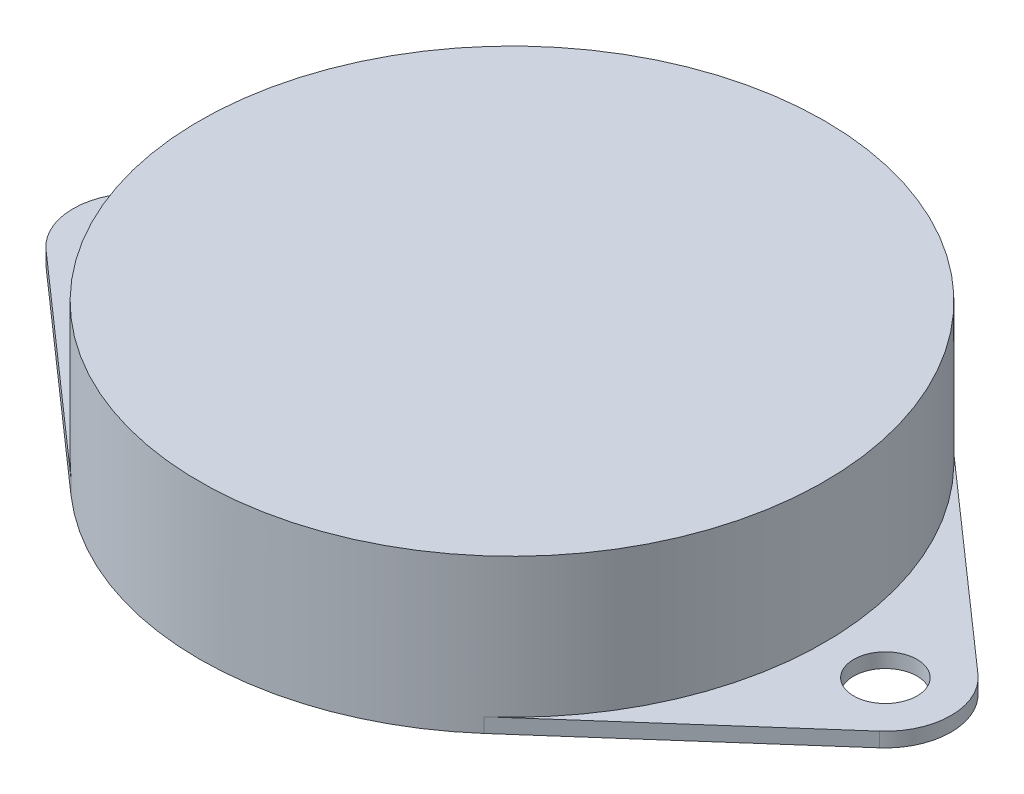
ISO-10303-21;
HEADER;
FILE_DESCRIPTION(('STEP AP214'),'2;1');
FILE_NAME('part.step','',(''),(''),'','','');
FILE_SCHEMA(('AUTOMOTIVE_DESIGN { 1 0 10303 214 1 1 1 1 }'));
ENDSEC;
DATA;
#1=APPLICATION_CONTEXT('core data for automotive mechanical design processes');
#2=APPLICATION_PROTOCOL_DEFINITION('international standard','automotive_design',2000,#1);
#3=PRODUCT_CONTEXT('',#1,'mechanical');
#4=PRODUCT('Part','Part','',(#3));
#5=PRODUCT_RELATED_PRODUCT_CATEGORY('part','',(#4));
#6=PRODUCT_DEFINITION_FORMATION('','',#4);
#7=PRODUCT_DEFINITION_CONTEXT('part definition',#1,'design');
#8=PRODUCT_DEFINITION('design','',#6,#7);
#9=PRODUCT_DEFINITION_SHAPE('','',#8);
#10=(LENGTH_UNIT() NAMED_UNIT(*) SI_UNIT(.MILLI.,.METRE.));
#11=(NAMED_UNIT(*) PLANE_ANGLE_UNIT() SI_UNIT($,.RADIAN.));
#12=(NAMED_UNIT(*) SI_UNIT($,.STERADIAN.) SOLID_ANGLE_UNIT());
#13=UNCERTAINTY_MEASURE_WITH_UNIT(LENGTH_MEASURE(1.E-05),#10,'distance_accuracy_value','');
#14=(GEOMETRIC_REPRESENTATION_CONTEXT(3) GLOBAL_UNCERTAINTY_ASSIGNED_CONTEXT((#13)) GLOBAL_UNIT_ASSIGNED_CONTEXT((#10,
#11,#12)) REPRESENTATION_CONTEXT('',''));
#15=CARTESIAN_POINT('',(0.,0.,0.));
#16=DIRECTION('',(0.,0.,1.));
#17=DIRECTION('',(1.,0.,0.));
#18=AXIS2_PLACEMENT_3D('',#15,#16,#17);
#19=CARTESIAN_POINT('',(20.955,0.8128,0.));
#20=DIRECTION('',(0.,-1.,0.));
#21=DIRECTION('',(0.,0.,-1.));
#22=AXIS2_PLACEMENT_3D('',#19,#20,#21);
#23=PLANE('',#22);
#24=CARTESIAN_POINT('',(20.955,0.8128,0.));
#25=DIRECTION('',(0.,1.,0.));
#26=DIRECTION('',(0.,0.,-1.));
#27=AXIS2_PLACEMENT_3D('',#24,#25,#26);
#28=CIRCLE('',#27,1.778);
#29=CARTESIAN_POINT('',(20.955,0.8128,-1.778));
#30=VERTEX_POINT('',#29);
#31=EDGE_CURVE('E296',#30,#30,#28,.T.);
#32=ORIENTED_EDGE('',*,*,#31,.F.);
#33=EDGE_LOOP('',(#32));
#34=FACE_BOUND('',#33,.T.);
#35=CARTESIAN_POINT('',(0.,0.8128,0.));
#36=DIRECTION('',(0.,1.,0.));
#37=DIRECTION('',(0.,0.,1.));
#38=AXIS2_PLACEMENT_3D('',#35,#36,#37);
#39=CIRCLE('',#38,17.5387);
#40=CARTESIAN_POINT('',(11.596801030303,0.8128,13.1575150979797));
#41=VERTEX_POINT('',#40);
#42=CARTESIAN_POINT('',(11.596801030303,0.8128,-13.1575150979797));
#43=VERTEX_POINT('',#42);
#44=EDGE_CURVE('E197',#41,#43,#39,.T.);
#45=ORIENTED_EDGE('',*,*,#44,.F.);
#46=DIRECTION('',(0.750198994109007,0.,-0.661212121212121));
#47=VECTOR('',#46,1.);
#48=CARTESIAN_POINT('',(23.3902442424242,0.8128,2.76298289530347));
#49=LINE('',#48,#47);
#50=CARTESIAN_POINT('',(23.3902442424242,0.8128,2.76298289530347));
#51=VERTEX_POINT('',#50);
#52=EDGE_CURVE('E60',#41,#51,#49,.T.);
#53=ORIENTED_EDGE('',*,*,#52,.T.);
#54=CARTESIAN_POINT('',(20.955,0.8128,0.));
#55=DIRECTION('',(0.,1.,0.));
#56=DIRECTION('',(0.,0.,-1.));
#57=AXIS2_PLACEMENT_3D('',#54,#55,#56);
#58=CIRCLE('',#57,3.683);
#59=CARTESIAN_POINT('',(23.3902442424242,0.8128,-2.76298289530347));
#60=VERTEX_POINT('',#59);
#61=EDGE_CURVE('E174',#51,#60,#58,.T.);
#62=ORIENTED_EDGE('',*,*,#61,.T.);
#63=DIRECTION('',(-0.750198994109007,0.,-0.661212121212121));
#64=VECTOR('',#63,1.);
#65=CARTESIAN_POINT('',(23.3902442424242,0.8128,-2.76298289530347));
#66=LINE('',#65,#64);
#67=EDGE_CURVE('E106',#60,#43,#66,.T.);
#68=ORIENTED_EDGE('',*,*,#67,.T.);
#69=EDGE_LOOP('',(#45,#53,#62,#68));
#70=FACE_BOUND('',#69,.T.);
#71=ADVANCED_FACE('F41',(#34,#70),#23,.F.);
#72=CARTESIAN_POINT('',(-20.955,0.8128,0.));
#73=DIRECTION('',(0.,1.,0.));
#74=DIRECTION('',(0.,0.,1.));
#75=AXIS2_PLACEMENT_3D('',#72,#73,#74);
#76=CIRCLE('',#75,1.778);
#77=CARTESIAN_POINT('',(-20.955,0.8128,1.778));
#78=VERTEX_POINT('',#77);
#79=EDGE_CURVE('E156',#78,#78,#76,.T.);
#80=ORIENTED_EDGE('',*,*,#79,.F.);
#81=EDGE_LOOP('',(#80));
#82=FACE_BOUND('',#81,.T.);
#83=CARTESIAN_POINT('',(-11.596801030303,0.8128,-13.1575150979797));
#84=VERTEX_POINT('',#83);
#85=CARTESIAN_POINT('',(-11.596801030303,0.8128,13.1575150979797));
#86=VERTEX_POINT('',#85);
#87=EDGE_CURVE('E193',#84,#86,#39,.T.);
#88=ORIENTED_EDGE('',*,*,#87,.F.);
#89=DIRECTION('',(-0.750198994109007,0.,0.661212121212121));
#90=VECTOR('',#89,1.);
#91=CARTESIAN_POINT('',(-23.3902442424242,0.8128,-2.76298289530347));
#92=LINE('',#91,#90);
#93=CARTESIAN_POINT('',(-23.3902442424242,0.8128,-2.76298289530347));
#94=VERTEX_POINT('',#93);
#95=EDGE_CURVE('E125',#84,#94,#92,.T.);
#96=ORIENTED_EDGE('',*,*,#95,.T.);
#97=CARTESIAN_POINT('',(-20.955,0.8128,0.));
#98=DIRECTION('',(0.,1.,0.));
#99=DIRECTION('',(0.,0.,1.));
#100=AXIS2_PLACEMENT_3D('',#97,#98,#99);
#101=CIRCLE('',#100,3.683);
#102=CARTESIAN_POINT('',(-23.3902442424242,0.8128,2.76298289530347));
#103=VERTEX_POINT('',#102);
#104=EDGE_CURVE('E118',#94,#103,#101,.T.);
#105=ORIENTED_EDGE('',*,*,#104,.T.);
#106=DIRECTION('',(0.750198994109007,0.,0.661212121212121));
#107=VECTOR('',#106,1.);
#108=CARTESIAN_POINT('',(-23.3902442424242,0.8128,2.76298289530347));
#109=LINE('',#108,#107);
#110=EDGE_CURVE('E122',#103,#86,#109,.T.);
#111=ORIENTED_EDGE('',*,*,#110,.T.);
#112=EDGE_LOOP('',(#88,#96,#105,#111));
#113=FACE_BOUND('',#112,.T.);
#114=ADVANCED_FACE('F120',(#82,#113),#23,.F.);
#115=CARTESIAN_POINT('',(20.955,0.,0.));
#116=DIRECTION('',(0.,-1.,0.));
#117=DIRECTION('',(0.,0.,-1.));
#118=AXIS2_PLACEMENT_3D('',#115,#116,#117);
#119=PLANE('',#118);
#120=CARTESIAN_POINT('',(0.,0.,0.));
#121=DIRECTION('',(0.,-1.,0.));
#122=DIRECTION('',(0.,0.,-1.));
#123=AXIS2_PLACEMENT_3D('',#120,#121,#122);
#124=CIRCLE('',#123,5.0165);
#125=CARTESIAN_POINT('',(0.,0.,5.0165));
#126=VERTEX_POINT('',#125);
#127=EDGE_CURVE('E45',#126,#126,#124,.T.);
#128=ORIENTED_EDGE('',*,*,#127,.F.);
#129=EDGE_LOOP('',(#128));
#130=FACE_BOUND('',#129,.T.);
#131=CARTESIAN_POINT('',(-20.955,0.,0.));
#132=DIRECTION('',(0.,1.,0.));
#133=DIRECTION('',(0.,0.,1.));
#134=AXIS2_PLACEMENT_3D('',#131,#132,#133);
#135=CIRCLE('',#134,1.778);
#136=CARTESIAN_POINT('',(-20.955,0.,1.778));
#137=VERTEX_POINT('',#136);
#138=EDGE_CURVE('E292',#137,#137,#135,.T.);
#139=ORIENTED_EDGE('',*,*,#138,.T.);
#140=EDGE_LOOP('',(#139));
#141=FACE_BOUND('',#140,.T.);
#142=CARTESIAN_POINT('',(20.955,0.,0.));
#143=DIRECTION('',(0.,1.,0.));
#144=DIRECTION('',(0.,0.,-1.));
#145=AXIS2_PLACEMENT_3D('',#142,#143,#144);
#146=CIRCLE('',#145,3.683);
#147=CARTESIAN_POINT('',(23.3902442424242,0.,2.76298289530347));
#148=VERTEX_POINT('',#147);
#149=CARTESIAN_POINT('',(23.3902442424242,0.,-2.76298289530347));
#150=VERTEX_POINT('',#149);
#151=EDGE_CURVE('E151',#148,#150,#146,.T.);
#152=ORIENTED_EDGE('',*,*,#151,.F.);
#153=DIRECTION('',(0.750198994109007,0.,-0.661212121212121));
#154=VECTOR('',#153,1.);
#155=CARTESIAN_POINT('',(23.3902442424242,0.,2.76298289530347));
#156=LINE('',#155,#154);
#157=CARTESIAN_POINT('',(11.596801030303,0.,13.1575150979797));
#158=VERTEX_POINT('',#157);
#159=EDGE_CURVE('E97',#158,#148,#156,.T.);
#160=ORIENTED_EDGE('',*,*,#159,.F.);
#161=CARTESIAN_POINT('',(0.,0.,0.));
#162=DIRECTION('',(0.,1.,0.));
#163=DIRECTION('',(0.,0.,1.));
#164=AXIS2_PLACEMENT_3D('',#161,#162,#163);
#165=CIRCLE('',#164,17.5387);
#166=CARTESIAN_POINT('',(-11.596801030303,0.,13.1575150979797));
#167=VERTEX_POINT('',#166);
#168=EDGE_CURVE('E91',#167,#158,#165,.T.);
#169=ORIENTED_EDGE('',*,*,#168,.F.);
#170=DIRECTION('',(0.750198994109007,0.,0.661212121212121));
#171=VECTOR('',#170,1.);
#172=CARTESIAN_POINT('',(-23.3902442424242,0.,2.76298289530347));
#173=LINE('',#172,#171);
#174=CARTESIAN_POINT('',(-23.3902442424242,0.,2.76298289530347));
#175=VERTEX_POINT('',#174);
#176=EDGE_CURVE('E167',#175,#167,#173,.T.);
#177=ORIENTED_EDGE('',*,*,#176,.F.);
#178=CARTESIAN_POINT('',(-20.955,0.,0.));
#179=DIRECTION('',(0.,1.,0.));
#180=DIRECTION('',(0.,0.,1.));
#181=AXIS2_PLACEMENT_3D('',#178,#179,#180);
#182=CIRCLE('',#181,3.683);
#183=CARTESIAN_POINT('',(-23.3902442424242,0.,-2.76298289530347));
#184=VERTEX_POINT('',#183);
#185=EDGE_CURVE('E135',#184,#175,#182,.T.);
#186=ORIENTED_EDGE('',*,*,#185,.F.);
#187=DIRECTION('',(-0.750198994109007,0.,0.661212121212121));
#188=VECTOR('',#187,1.);
#189=CARTESIAN_POINT('',(-23.3902442424242,0.,-2.76298289530347));
#190=LINE('',#189,#188);
#191=CARTESIAN_POINT('',(-11.596801030303,0.,-13.1575150979797));
#192=VERTEX_POINT('',#191);
#193=EDGE_CURVE('E162',#192,#184,#190,.T.);
#194=ORIENTED_EDGE('',*,*,#193,.F.);
#195=CARTESIAN_POINT('',(0.,0.,0.));
#196=DIRECTION('',(0.,1.,0.));
#197=DIRECTION('',(0.,0.,1.));
#198=AXIS2_PLACEMENT_3D('',#195,#196,#197);
#199=CIRCLE('',#198,17.5387);
#200=CARTESIAN_POINT('',(11.596801030303,0.,-13.1575150979797));
#201=VERTEX_POINT('',#200);
#202=EDGE_CURVE('E159',#201,#192,#199,.T.);
#203=ORIENTED_EDGE('',*,*,#202,.F.);
#204=DIRECTION('',(-0.750198994109007,0.,-0.661212121212121));
#205=VECTOR('',#204,1.);
#206=CARTESIAN_POINT('',(23.3902442424242,0.,-2.76298289530347));
#207=LINE('',#206,#205);
#208=EDGE_CURVE('E155',#150,#201,#207,.T.);
#209=ORIENTED_EDGE('',*,*,#208,.F.);
#210=EDGE_LOOP('',(#152,#160,#169,#177,#186,#194,#203,#209));
#211=FACE_BOUND('',#210,.T.);
#212=CARTESIAN_POINT('',(20.955,0.,0.));
#213=DIRECTION('',(0.,1.,0.));
#214=DIRECTION('',(0.,0.,-1.));
#215=AXIS2_PLACEMENT_3D('',#212,#213,#214);
#216=CIRCLE('',#215,1.778);
#217=CARTESIAN_POINT('',(20.955,0.,-1.778));
#218=VERTEX_POINT('',#217);
#219=EDGE_CURVE('E210',#218,#218,#216,.T.);
#220=ORIENTED_EDGE('',*,*,#219,.T.);
#221=EDGE_LOOP('',(#220));
#222=FACE_BOUND('',#221,.T.);
#223=ADVANCED_FACE('F251',(#130,#141,#211,#222),#119,.T.);
#224=CARTESIAN_POINT('',(20.955,0.8128,0.));
#225=DIRECTION('',(0.,-1.,0.));
#226=DIRECTION('',(0.,0.,-1.));
#227=AXIS2_PLACEMENT_3D('',#224,#225,#226);
#228=CYLINDRICAL_SURFACE('',#227,3.683);
#229=ORIENTED_EDGE('',*,*,#151,.T.);
#230=DIRECTION('',(0.,-1.,0.));
#231=VECTOR('',#230,1.);
#232=CARTESIAN_POINT('',(23.3902442424242,0.8128,-2.76298289530347));
#233=LINE('',#232,#231);
#234=EDGE_CURVE('E191',#60,#150,#233,.T.);
#235=ORIENTED_EDGE('',*,*,#234,.F.);
#236=ORIENTED_EDGE('',*,*,#61,.F.);
#237=DIRECTION('',(0.,-1.,0.));
#238=VECTOR('',#237,1.);
#239=CARTESIAN_POINT('',(23.3902442424242,0.8128,2.76298289530347));
#240=LINE('',#239,#238);
#241=EDGE_CURVE('E147',#51,#148,#240,.T.);
#242=ORIENTED_EDGE('',*,*,#241,.T.);
#243=EDGE_LOOP('',(#229,#235,#236,#242));
#244=FACE_BOUND('',#243,.T.);
#245=ADVANCED_FACE('F43',(#244),#228,.T.);
#246=CARTESIAN_POINT('',(23.3902442424242,0.8128,-2.76298289530347));
#247=DIRECTION('',(-0.661212121212121,0.,0.750198994109007));
#248=DIRECTION('',(0.750198994109008,0.,0.661212121212122));
#249=AXIS2_PLACEMENT_3D('',#246,#247,#248);
#250=PLANE('',#249);
#251=ORIENTED_EDGE('',*,*,#208,.T.);
#252=DIRECTION('',(0.,-1.,0.));
#253=VECTOR('',#252,1.);
#254=CARTESIAN_POINT('',(11.596801030303,0.8128,-13.1575150979797));
#255=LINE('',#254,#253);
#256=EDGE_CURVE('E188',#43,#201,#255,.T.);
#257=ORIENTED_EDGE('',*,*,#256,.F.);
#258=ORIENTED_EDGE('',*,*,#67,.F.);
#259=ORIENTED_EDGE('',*,*,#234,.T.);
#260=EDGE_LOOP('',(#251,#257,#258,#259));
#261=FACE_BOUND('',#260,.T.);
#262=ADVANCED_FACE('F273',(#261),#250,.F.);
#263=CARTESIAN_POINT('',(-23.3902442424242,0.8128,-2.76298289530347));
#264=DIRECTION('',(0.661212121212121,0.,0.750198994109007));
#265=DIRECTION('',(0.750198994109008,0.,-0.661212121212122));
#266=AXIS2_PLACEMENT_3D('',#263,#264,#265);
#267=PLANE('',#266);
#268=ORIENTED_EDGE('',*,*,#193,.T.);
#269=DIRECTION('',(0.,-1.,0.));
#270=VECTOR('',#269,1.);
#271=CARTESIAN_POINT('',(-23.3902442424242,0.8128,-2.76298289530347));
#272=LINE('',#271,#270);
#273=EDGE_CURVE('E139',#94,#184,#272,.T.);
#274=ORIENTED_EDGE('',*,*,#273,.F.);
#275=ORIENTED_EDGE('',*,*,#95,.F.);
#276=DIRECTION('',(0.,-1.,0.));
#277=VECTOR('',#276,1.);
#278=CARTESIAN_POINT('',(-11.596801030303,0.8128,-13.1575150979797));
#279=LINE('',#278,#277);
#280=EDGE_CURVE('E184',#84,#192,#279,.T.);
#281=ORIENTED_EDGE('',*,*,#280,.T.);
#282=EDGE_LOOP('',(#268,#274,#275,#281));
#283=FACE_BOUND('',#282,.T.);
#284=ADVANCED_FACE('F271',(#283),#267,.F.);
#285=CARTESIAN_POINT('',(-20.955,0.8128,0.));
#286=DIRECTION('',(0.,-1.,0.));
#287=DIRECTION('',(0.,0.,-1.));
#288=AXIS2_PLACEMENT_3D('',#285,#286,#287);
#289=CYLINDRICAL_SURFACE('',#288,3.683);
#290=ORIENTED_EDGE('',*,*,#185,.T.);
#291=DIRECTION('',(0.,-1.,0.));
#292=VECTOR('',#291,1.);
#293=CARTESIAN_POINT('',(-23.3902442424242,0.8128,2.76298289530347));
#294=LINE('',#293,#292);
#295=EDGE_CURVE('E132',#103,#175,#294,.T.);
#296=ORIENTED_EDGE('',*,*,#295,.F.);
#297=ORIENTED_EDGE('',*,*,#104,.F.);
#298=ORIENTED_EDGE('',*,*,#273,.T.);
#299=EDGE_LOOP('',(#290,#296,#297,#298));
#300=FACE_BOUND('',#299,.T.);
#301=ADVANCED_FACE('F133',(#300),#289,.T.);
#302=CARTESIAN_POINT('',(-23.3902442424242,0.8128,2.76298289530347));
#303=DIRECTION('',(0.661212121212121,0.,-0.750198994109007));
#304=DIRECTION('',(-0.750198994109008,0.,-0.661212121212122));
#305=AXIS2_PLACEMENT_3D('',#302,#303,#304);
#306=PLANE('',#305);
#307=ORIENTED_EDGE('',*,*,#176,.T.);
#308=DIRECTION('',(0.,-1.,0.));
#309=VECTOR('',#308,1.);
#310=CARTESIAN_POINT('',(-11.596801030303,0.8128,13.1575150979797));
#311=LINE('',#310,#309);
#312=EDGE_CURVE('E140',#86,#167,#311,.T.);
#313=ORIENTED_EDGE('',*,*,#312,.F.);
#314=ORIENTED_EDGE('',*,*,#110,.F.);
#315=ORIENTED_EDGE('',*,*,#295,.T.);
#316=EDGE_LOOP('',(#307,#313,#314,#315));
#317=FACE_BOUND('',#316,.T.);
#318=ADVANCED_FACE('F142',(#317),#306,.F.);
#319=CARTESIAN_POINT('',(0.,0.8128,0.));
#320=DIRECTION('',(0.,-1.,0.));
#321=DIRECTION('',(0.,0.,-1.));
#322=AXIS2_PLACEMENT_3D('',#319,#320,#321);
#323=CYLINDRICAL_SURFACE('',#322,17.5387);
#324=ORIENTED_EDGE('',*,*,#168,.T.);
#325=DIRECTION('',(0.,-1.,0.));
#326=VECTOR('',#325,1.);
#327=CARTESIAN_POINT('',(11.596801030303,0.8128,13.1575150979797));
#328=LINE('',#327,#326);
#329=EDGE_CURVE('E177',#41,#158,#328,.T.);
#330=ORIENTED_EDGE('',*,*,#329,.F.);
#331=ORIENTED_EDGE('',*,*,#44,.T.);
#332=ORIENTED_EDGE('',*,*,#256,.T.);
#333=ORIENTED_EDGE('',*,*,#202,.T.);
#334=ORIENTED_EDGE('',*,*,#280,.F.);
#335=ORIENTED_EDGE('',*,*,#87,.T.);
#336=ORIENTED_EDGE('',*,*,#312,.T.);
#337=EDGE_LOOP('',(#324,#330,#331,#332,#333,#334,#335,#336));
#338=FACE_BOUND('',#337,.T.);
#339=CARTESIAN_POINT('',(0.,8.636,0.));
#340=DIRECTION('',(0.,-1.,0.));
#341=DIRECTION('',(0.,0.,-1.));
#342=AXIS2_PLACEMENT_3D('',#339,#340,#341);
#343=CIRCLE('',#342,17.5387);
#344=CARTESIAN_POINT('',(0.,8.636,-17.5387));
#345=VERTEX_POINT('',#344);
#346=EDGE_CURVE('E205',#345,#345,#343,.T.);
#347=ORIENTED_EDGE('',*,*,#346,.T.);
#348=EDGE_LOOP('',(#347));
#349=FACE_BOUND('',#348,.T.);
#350=ADVANCED_FACE('F264',(#338,#349),#323,.T.);
#351=CARTESIAN_POINT('',(23.3902442424242,0.8128,2.76298289530347));
#352=DIRECTION('',(-0.661212121212121,0.,-0.750198994109007));
#353=DIRECTION('',(-0.750198994109008,0.,0.661212121212122));
#354=AXIS2_PLACEMENT_3D('',#351,#352,#353);
#355=PLANE('',#354);
#356=ORIENTED_EDGE('',*,*,#159,.T.);
#357=ORIENTED_EDGE('',*,*,#241,.F.);
#358=ORIENTED_EDGE('',*,*,#52,.F.);
#359=ORIENTED_EDGE('',*,*,#329,.T.);
#360=EDGE_LOOP('',(#356,#357,#358,#359));
#361=FACE_BOUND('',#360,.T.);
#362=ADVANCED_FACE('F261',(#361),#355,.F.);
#363=CARTESIAN_POINT('',(-20.955,0.8128,0.));
#364=DIRECTION('',(0.,-1.,0.));
#365=DIRECTION('',(0.,0.,-1.));
#366=AXIS2_PLACEMENT_3D('',#363,#364,#365);
#367=CYLINDRICAL_SURFACE('',#366,1.778);
#368=ORIENTED_EDGE('',*,*,#79,.T.);
#369=EDGE_LOOP('',(#368));
#370=FACE_BOUND('',#369,.T.);
#371=ORIENTED_EDGE('',*,*,#138,.F.);
#372=EDGE_LOOP('',(#371));
#373=FACE_BOUND('',#372,.T.);
#374=ADVANCED_FACE('F256',(#370,#373),#367,.F.);
#375=CARTESIAN_POINT('',(20.955,0.8128,0.));
#376=DIRECTION('',(0.,-1.,0.));
#377=DIRECTION('',(0.,0.,-1.));
#378=AXIS2_PLACEMENT_3D('',#375,#376,#377);
#379=CYLINDRICAL_SURFACE('',#378,1.778);
#380=ORIENTED_EDGE('',*,*,#31,.T.);
#381=EDGE_LOOP('',(#380));
#382=FACE_BOUND('',#381,.T.);
#383=ORIENTED_EDGE('',*,*,#219,.F.);
#384=EDGE_LOOP('',(#383));
#385=FACE_BOUND('',#384,.T.);
#386=ADVANCED_FACE('F306',(#382,#385),#379,.F.);
#387=CARTESIAN_POINT('',(20.955,8.636,0.));
#388=DIRECTION('',(0.,-1.,0.));
#389=DIRECTION('',(0.,0.,-1.));
#390=AXIS2_PLACEMENT_3D('',#387,#388,#389);
#391=PLANE('',#390);
#392=ORIENTED_EDGE('',*,*,#346,.F.);
#393=EDGE_LOOP('',(#392));
#394=FACE_BOUND('',#393,.T.);
#395=ADVANCED_FACE('F309',(#394),#391,.F.);
#396=CARTESIAN_POINT('',(0.,-1.524,0.));
#397=DIRECTION('',(0.,1.,0.));
#398=DIRECTION('',(0.,0.,1.));
#399=AXIS2_PLACEMENT_3D('',#396,#397,#398);
#400=CYLINDRICAL_SURFACE('',#399,5.0165);
#401=CARTESIAN_POINT('',(0.,-1.524,0.));
#402=DIRECTION('',(0.,1.,0.));
#403=DIRECTION('',(0.,0.,1.));
#404=AXIS2_PLACEMENT_3D('',#401,#402,#403);
#405=CIRCLE('',#404,5.0165);
#406=CARTESIAN_POINT('',(0.,-1.524,5.0165));
#407=VERTEX_POINT('',#406);
#408=EDGE_CURVE('E206',#407,#407,#405,.T.);
#409=CARTESIAN_POINT('',(0.,-1.524,5.0165));
#410=CARTESIAN_POINT('',(0.,-1.508125,5.0165));
#411=CARTESIAN_POINT('',(0.,-1.49225,5.0165));
#412=CARTESIAN_POINT('',(0.,-1.4605,5.0165));
#413=CARTESIAN_POINT('',(0.,-1.444625,5.0165));
#414=CARTESIAN_POINT('',(0.,-1.412875,5.0165));
#415=CARTESIAN_POINT('',(0.,-1.397,5.0165));
#416=CARTESIAN_POINT('',(0.,-1.36525,5.0165));
#417=CARTESIAN_POINT('',(0.,-1.349375,5.0165));
#418=CARTESIAN_POINT('',(0.,-1.317625,5.0165));
#419=CARTESIAN_POINT('',(0.,-1.30175,5.0165));
#420=CARTESIAN_POINT('',(0.,-1.27,5.0165));
#421=CARTESIAN_POINT('',(0.,-1.254125,5.0165));
#422=CARTESIAN_POINT('',(0.,-1.222375,5.0165));
#423=CARTESIAN_POINT('',(0.,-1.2065,5.0165));
#424=CARTESIAN_POINT('',(0.,-1.17475,5.0165));
#425=CARTESIAN_POINT('',(0.,-1.158875,5.0165));
#426=CARTESIAN_POINT('',(0.,-1.127125,5.0165));
#427=CARTESIAN_POINT('',(0.,-1.11125,5.0165));
#428=CARTESIAN_POINT('',(0.,-1.0795,5.0165));
#429=CARTESIAN_POINT('',(0.,-1.063625,5.0165));
#430=CARTESIAN_POINT('',(0.,-1.031875,5.0165));
#431=CARTESIAN_POINT('',(0.,-1.016,5.0165));
#432=CARTESIAN_POINT('',(0.,-0.98425,5.0165));
#433=CARTESIAN_POINT('',(0.,-0.968375,5.0165));
#434=CARTESIAN_POINT('',(0.,-0.936625,5.0165));
#435=CARTESIAN_POINT('',(0.,-0.92075,5.0165));
#436=CARTESIAN_POINT('',(0.,-0.889,5.0165));
#437=CARTESIAN_POINT('',(0.,-0.873125,5.0165));
#438=CARTESIAN_POINT('',(0.,-0.841375,5.0165));
#439=CARTESIAN_POINT('',(0.,-0.8255,5.0165));
#440=CARTESIAN_POINT('',(0.,-0.79375,5.0165));
#441=CARTESIAN_POINT('',(0.,-0.777875,5.0165));
#442=CARTESIAN_POINT('',(0.,-0.746125,5.0165));
#443=CARTESIAN_POINT('',(0.,-0.73025,5.0165));
#444=CARTESIAN_POINT('',(0.,-0.6985,5.0165));
#445=CARTESIAN_POINT('',(0.,-0.682625,5.0165));
#446=CARTESIAN_POINT('',(0.,-0.650875,5.0165));
#447=CARTESIAN_POINT('',(0.,-0.635,5.0165));
#448=CARTESIAN_POINT('',(0.,-0.60325,5.0165));
#449=CARTESIAN_POINT('',(0.,-0.587375,5.0165));
#450=CARTESIAN_POINT('',(0.,-0.555625,5.0165));
#451=CARTESIAN_POINT('',(0.,-0.53975,5.0165));
#452=CARTESIAN_POINT('',(0.,-0.508,5.0165));
#453=CARTESIAN_POINT('',(0.,-0.492125,5.0165));
#454=CARTESIAN_POINT('',(0.,-0.460375,5.0165));
#455=CARTESIAN_POINT('',(0.,-0.4445,5.0165));
#456=CARTESIAN_POINT('',(0.,-0.41275,5.0165));
#457=CARTESIAN_POINT('',(0.,-0.396875,5.0165));
#458=CARTESIAN_POINT('',(0.,-0.365125,5.0165));
#459=CARTESIAN_POINT('',(0.,-0.34925,5.0165));
#460=CARTESIAN_POINT('',(0.,-0.3175,5.0165));
#461=CARTESIAN_POINT('',(0.,-0.301625,5.0165));
#462=CARTESIAN_POINT('',(0.,-0.269875,5.0165));
#463=CARTESIAN_POINT('',(0.,-0.254,5.0165));
#464=CARTESIAN_POINT('',(0.,-0.22225,5.0165));
#465=CARTESIAN_POINT('',(0.,-0.206375,5.0165));
#466=CARTESIAN_POINT('',(0.,-0.174625,5.0165));
#467=CARTESIAN_POINT('',(0.,-0.15875,5.0165));
#468=CARTESIAN_POINT('',(0.,-0.127,5.0165));
#469=CARTESIAN_POINT('',(0.,-0.111125,5.0165));
#470=CARTESIAN_POINT('',(0.,-0.079375,5.0165));
#471=CARTESIAN_POINT('',(0.,-0.0635,5.0165));
#472=CARTESIAN_POINT('',(0.,-0.0317499999999999,5.0165));
#473=CARTESIAN_POINT('',(0.,-0.015875,5.0165));
#474=CARTESIAN_POINT('',(0.,0.,5.0165));
#475=B_SPLINE_CURVE_WITH_KNOTS('',3,(#409,#410,#411,#412,#413,#414,#415,#416,#417,#418,#419,
#420,#421,#422,#423,#424,#425,#426,#427,#428,#429,#430,#431,#432,#433,#434,#435,#436,#437,#438,
#439,#440,#441,#442,#443,#444,#445,#446,#447,#448,#449,#450,#451,#452,#453,#454,#455,#456,#457,
#458,#459,#460,#461,#462,#463,#464,#465,#466,#467,#468,#469,#470,#471,#472,#473,#474),
.UNSPECIFIED.,.F.,.F.,(4,2,2,2,2,2,2,2,2,2,2,2,2,2,2,2,2,2,2,2,2,2,2,2,2,2,2,2,2,2,2,2,4),(0.,
0.0476249999999999,0.0952499999999998,0.142875,0.1905,0.238125,0.28575,0.333375,0.381,0.428625,
0.47625,0.523875,0.5715,0.619125,0.66675,0.714375,0.762,0.809625,0.85725,0.904875,0.9525,
1.000125,1.04775,1.095375,1.143,1.190625,1.23825,1.285875,1.3335,1.381125,1.42875,1.476375,
1.524),.UNSPECIFIED.);
#476=EDGE_CURVE('BSEAM315',#407,#126,#475,.T.);
#477=ORIENTED_EDGE('',*,*,#408,.T.);
#478=ORIENTED_EDGE('',*,*,#127,.T.);
#479=ORIENTED_EDGE('',*,*,#476,.T.);
#480=ORIENTED_EDGE('',*,*,#476,.F.);
#481=EDGE_LOOP('',(#477,#479,#478,#480));
#482=FACE_BOUND('',#481,.T.);
#483=ADVANCED_FACE('F315',(#482),#400,.T.);
#484=CARTESIAN_POINT('',(0.,-1.524,0.));
#485=DIRECTION('',(0.,1.,0.));
#486=DIRECTION('',(0.,0.,1.));
#487=AXIS2_PLACEMENT_3D('',#484,#485,#486);
#488=PLANE('',#487);
#489=CARTESIAN_POINT('',(0.,-1.524,0.));
#490=DIRECTION('',(0.,-1.,0.));
#491=DIRECTION('',(0.,0.,-1.));
#492=AXIS2_PLACEMENT_3D('',#489,#490,#491);
#493=CIRCLE('',#492,1.016);
#494=CARTESIAN_POINT('',(0.,-1.524,1.016));
#495=VERTEX_POINT('',#494);
#496=EDGE_CURVE('E12',#495,#495,#493,.T.);
#497=ORIENTED_EDGE('',*,*,#496,.F.);
#498=EDGE_LOOP('',(#497));
#499=FACE_BOUND('',#498,.T.);
#500=ORIENTED_EDGE('',*,*,#408,.F.);
#501=EDGE_LOOP('',(#500));
#502=FACE_BOUND('',#501,.T.);
#503=ADVANCED_FACE('F322',(#499,#502),#488,.F.);
#504=CARTESIAN_POINT('',(0.,-5.334,0.));
#505=DIRECTION('',(0.,1.,0.));
#506=DIRECTION('',(0.,0.,1.));
#507=AXIS2_PLACEMENT_3D('',#504,#505,#506);
#508=CYLINDRICAL_SURFACE('',#507,1.016);
#509=CARTESIAN_POINT('',(0.,-5.334,0.));
#510=DIRECTION('',(0.,-1.,0.));
#511=DIRECTION('',(0.,0.,-1.));
#512=AXIS2_PLACEMENT_3D('',#509,#510,#511);
#513=CIRCLE('',#512,1.016);
#514=CARTESIAN_POINT('',(0.,-5.334,1.016));
#515=VERTEX_POINT('',#514);
#516=EDGE_CURVE('E212',#515,#515,#513,.T.);
#517=CARTESIAN_POINT('',(0.,-5.334,1.016));
#518=CARTESIAN_POINT('',(0.,-5.2943125,1.016));
#519=CARTESIAN_POINT('',(0.,-5.254625,1.016));
#520=CARTESIAN_POINT('',(0.,-5.17525,1.016));
#521=CARTESIAN_POINT('',(0.,-5.1355625,1.016));
#522=CARTESIAN_POINT('',(0.,-5.0561875,1.016));
#523=CARTESIAN_POINT('',(0.,-5.0165,1.016));
#524=CARTESIAN_POINT('',(0.,-4.937125,1.016));
#525=CARTESIAN_POINT('',(0.,-4.8974375,1.016));
#526=CARTESIAN_POINT('',(0.,-4.8180625,1.016));
#527=CARTESIAN_POINT('',(0.,-4.778375,1.016));
#528=CARTESIAN_POINT('',(0.,-4.699,1.016));
#529=CARTESIAN_POINT('',(0.,-4.6593125,1.016));
#530=CARTESIAN_POINT('',(0.,-4.5799375,1.016));
#531=CARTESIAN_POINT('',(0.,-4.54025,1.016));
#532=CARTESIAN_POINT('',(0.,-4.460875,1.016));
#533=CARTESIAN_POINT('',(0.,-4.4211875,1.016));
#534=CARTESIAN_POINT('',(0.,-4.3418125,1.016));
#535=CARTESIAN_POINT('',(0.,-4.302125,1.016));
#536=CARTESIAN_POINT('',(0.,-4.22275,1.016));
#537=CARTESIAN_POINT('',(0.,-4.1830625,1.016));
#538=CARTESIAN_POINT('',(0.,-4.1036875,1.016));
#539=CARTESIAN_POINT('',(0.,-4.064,1.016));
#540=CARTESIAN_POINT('',(0.,-3.984625,1.016));
#541=CARTESIAN_POINT('',(0.,-3.9449375,1.016));
#542=CARTESIAN_POINT('',(0.,-3.8655625,1.016));
#543=CARTESIAN_POINT('',(0.,-3.825875,1.016));
#544=CARTESIAN_POINT('',(0.,-3.7465,1.016));
#545=CARTESIAN_POINT('',(0.,-3.7068125,1.016));
#546=CARTESIAN_POINT('',(0.,-3.6274375,1.016));
#547=CARTESIAN_POINT('',(0.,-3.58775,1.016));
#548=CARTESIAN_POINT('',(0.,-3.508375,1.016));
#549=CARTESIAN_POINT('',(0.,-3.4686875,1.016));
#550=CARTESIAN_POINT('',(0.,-3.3893125,1.016));
#551=CARTESIAN_POINT('',(0.,-3.349625,1.016));
#552=CARTESIAN_POINT('',(0.,-3.27025,1.016));
#553=CARTESIAN_POINT('',(0.,-3.2305625,1.016));
#554=CARTESIAN_POINT('',(0.,-3.1511875,1.016));
#555=CARTESIAN_POINT('',(0.,-3.1115,1.016));
#556=CARTESIAN_POINT('',(0.,-3.032125,1.016));
#557=CARTESIAN_POINT('',(0.,-2.9924375,1.016));
#558=CARTESIAN_POINT('',(0.,-2.9130625,1.016));
#559=CARTESIAN_POINT('',(0.,-2.873375,1.016));
#560=CARTESIAN_POINT('',(0.,-2.794,1.016));
#561=CARTESIAN_POINT('',(0.,-2.7543125,1.016));
#562=CARTESIAN_POINT('',(0.,-2.6749375,1.016));
#563=CARTESIAN_POINT('',(0.,-2.63525,1.016));
#564=CARTESIAN_POINT('',(0.,-2.555875,1.016));
#565=CARTESIAN_POINT('',(0.,-2.5161875,1.016));
#566=CARTESIAN_POINT('',(0.,-2.4368125,1.016));
#567=CARTESIAN_POINT('',(0.,-2.397125,1.016));
#568=CARTESIAN_POINT('',(0.,-2.31775,1.016));
#569=CARTESIAN_POINT('',(0.,-2.2780625,1.016));
#570=CARTESIAN_POINT('',(0.,-2.1986875,1.016));
#571=CARTESIAN_POINT('',(0.,-2.159,1.016));
#572=CARTESIAN_POINT('',(0.,-2.079625,1.016));
#573=CARTESIAN_POINT('',(0.,-2.0399375,1.016));
#574=CARTESIAN_POINT('',(0.,-1.9605625,1.016));
#575=CARTESIAN_POINT('',(0.,-1.920875,1.016));
#576=CARTESIAN_POINT('',(0.,-1.8415,1.016));
#577=CARTESIAN_POINT('',(0.,-1.8018125,1.016));
#578=CARTESIAN_POINT('',(0.,-1.7224375,1.016));
#579=CARTESIAN_POINT('',(0.,-1.68275,1.016));
#580=CARTESIAN_POINT('',(0.,-1.603375,1.016));
#581=CARTESIAN_POINT('',(0.,-1.5636875,1.016));
#582=CARTESIAN_POINT('',(0.,-1.524,1.016));
#583=B_SPLINE_CURVE_WITH_KNOTS('',3,(#517,#518,#519,#520,#521,#522,#523,#524,#525,#526,#527,
#528,#529,#530,#531,#532,#533,#534,#535,#536,#537,#538,#539,#540,#541,#542,#543,#544,#545,#546,
#547,#548,#549,#550,#551,#552,#553,#554,#555,#556,#557,#558,#559,#560,#561,#562,#563,#564,#565,
#566,#567,#568,#569,#570,#571,#572,#573,#574,#575,#576,#577,#578,#579,#580,#581,#582),
.UNSPECIFIED.,.F.,.F.,(4,2,2,2,2,2,2,2,2,2,2,2,2,2,2,2,2,2,2,2,2,2,2,2,2,2,2,2,2,2,2,2,4),(0.,
0.119062499999999,0.238125,0.3571875,0.476249999999999,0.595312499999999,0.714375,
0.833437499999999,0.952499999999999,1.0715625,1.190625,1.3096875,1.42875,1.5478125,1.666875,
1.7859375,1.905,2.0240625,2.143125,2.2621875,2.38125,2.5003125,2.619375,2.7384375,2.8575,
2.9765625,3.095625,3.2146875,3.33375,3.4528125,3.571875,3.6909375,3.81),.UNSPECIFIED.);
#584=EDGE_CURVE('BSEAM242',#515,#495,#583,.T.);
#585=ORIENTED_EDGE('',*,*,#516,.F.);
#586=ORIENTED_EDGE('',*,*,#496,.T.);
#587=ORIENTED_EDGE('',*,*,#584,.T.);
#588=ORIENTED_EDGE('',*,*,#584,.F.);
#589=EDGE_LOOP('',(#585,#587,#586,#588));
#590=FACE_BOUND('',#589,.T.);
#591=ADVANCED_FACE('F242',(#590),#508,.T.);
#592=CARTESIAN_POINT('',(0.,-37.7619380798113,0.));
#593=DIRECTION('',(0.,1.,0.));
#594=DIRECTION('',(0.,0.,1.));
#595=AXIS2_PLACEMENT_3D('',#592,#593,#594);
#596=CYLINDRICAL_SURFACE('',#595,4.191);
#597=CARTESIAN_POINT('',(0.,-5.334,0.));
#598=DIRECTION('',(0.,-1.,0.));
#599=DIRECTION('',(0.,0.,-1.));
#600=AXIS2_PLACEMENT_3D('',#597,#598,#599);
#601=CIRCLE('',#600,4.191);
#602=CARTESIAN_POINT('',(0.,-5.334,-4.191));
#603=VERTEX_POINT('',#602);
#604=EDGE_CURVE('E223',#603,#603,#601,.T.);
#605=ORIENTED_EDGE('',*,*,#604,.T.);
#606=EDGE_LOOP('',(#605));
#607=FACE_BOUND('',#606,.T.);
#608=CARTESIAN_POINT('',(0.,-8.636,0.));
#609=DIRECTION('',(0.,-1.,0.));
#610=DIRECTION('',(0.,0.,-1.));
#611=AXIS2_PLACEMENT_3D('',#608,#609,#610);
#612=CIRCLE('',#611,4.191);
#613=CARTESIAN_POINT('',(0.,-8.636,-4.191));
#614=VERTEX_POINT('',#613);
#615=EDGE_CURVE('E217',#614,#614,#612,.T.);
#616=ORIENTED_EDGE('',*,*,#615,.F.);
#617=EDGE_LOOP('',(#616));
#618=FACE_BOUND('',#617,.T.);
#619=ADVANCED_FACE('F228',(#607,#618),#596,.T.);
#620=CARTESIAN_POINT('',(0.,-5.334,0.));
#621=DIRECTION('',(0.,-1.,0.));
#622=DIRECTION('',(0.,0.,-1.));
#623=AXIS2_PLACEMENT_3D('',#620,#621,#622);
#624=PLANE('',#623);
#625=ORIENTED_EDGE('',*,*,#516,.T.);
#626=EDGE_LOOP('',(#625));
#627=FACE_BOUND('',#626,.T.);
#628=ORIENTED_EDGE('',*,*,#604,.F.);
#629=EDGE_LOOP('',(#628));
#630=FACE_BOUND('',#629,.T.);
#631=ADVANCED_FACE('F231',(#627,#630),#624,.F.);
#632=CARTESIAN_POINT('',(20.955,-8.636,0.));
#633=DIRECTION('',(0.,-1.,0.));
#634=DIRECTION('',(0.,0.,-1.));
#635=AXIS2_PLACEMENT_3D('',#632,#633,#634);
#636=PLANE('',#635);
#637=ORIENTED_EDGE('',*,*,#615,.T.);
#638=EDGE_LOOP('',(#637));
#639=FACE_BOUND('',#638,.T.);
#640=ADVANCED_FACE('F233',(#639),#636,.T.);
#641=CLOSED_SHELL('',(#71,#114,#223,#245,#262,#284,#301,#318,#350,#362,#374,#386,#395,#483,#503,
#591,#619,#631,#640));
#642=MANIFOLD_SOLID_BREP('B2',#641);
#643=ADVANCED_BREP_SHAPE_REPRESENTATION('',(#18,#642),#14);
#644=SHAPE_DEFINITION_REPRESENTATION(#9,#643);
ENDSEC;
END-ISO-10303-21;
